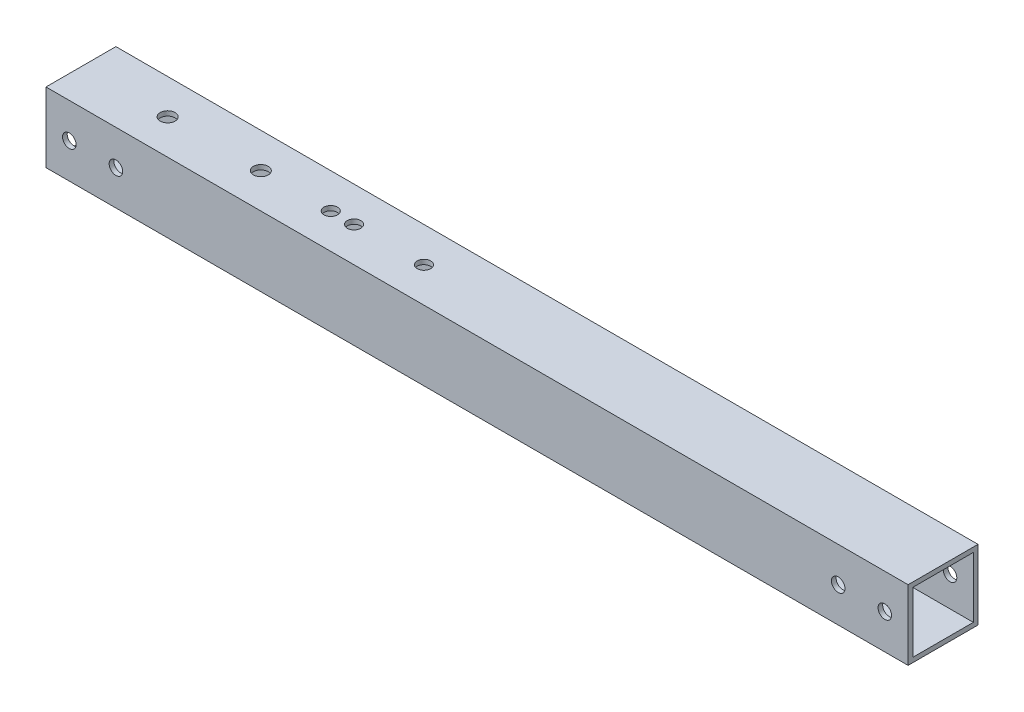
ISO-10303-21;
HEADER;
FILE_DESCRIPTION(('STEP AP214'),'2;1');
FILE_NAME('part.step','',(''),(''),'','','');
FILE_SCHEMA(('AUTOMOTIVE_DESIGN { 1 0 10303 214 1 1 1 1 }'));
ENDSEC;
DATA;
#1=APPLICATION_CONTEXT('core data for automotive mechanical design processes');
#2=APPLICATION_PROTOCOL_DEFINITION('international standard','automotive_design',2000,#1);
#3=PRODUCT_CONTEXT('',#1,'mechanical');
#4=PRODUCT('Part','Part','',(#3));
#5=PRODUCT_RELATED_PRODUCT_CATEGORY('part','',(#4));
#6=PRODUCT_DEFINITION_FORMATION('','',#4);
#7=PRODUCT_DEFINITION_CONTEXT('part definition',#1,'design');
#8=PRODUCT_DEFINITION('design','',#6,#7);
#9=PRODUCT_DEFINITION_SHAPE('','',#8);
#10=(LENGTH_UNIT() NAMED_UNIT(*) SI_UNIT(.MILLI.,.METRE.));
#11=(NAMED_UNIT(*) PLANE_ANGLE_UNIT() SI_UNIT($,.RADIAN.));
#12=(NAMED_UNIT(*) SI_UNIT($,.STERADIAN.) SOLID_ANGLE_UNIT());
#13=UNCERTAINTY_MEASURE_WITH_UNIT(LENGTH_MEASURE(1.E-05),#10,'distance_accuracy_value','');
#14=(GEOMETRIC_REPRESENTATION_CONTEXT(3) GLOBAL_UNCERTAINTY_ASSIGNED_CONTEXT((#13)) GLOBAL_UNIT_ASSIGNED_CONTEXT((#10,
#11,#12)) REPRESENTATION_CONTEXT('',''));
#15=CARTESIAN_POINT('',(0.,0.,0.));
#16=DIRECTION('',(0.,0.,1.));
#17=DIRECTION('',(1.,0.,0.));
#18=AXIS2_PLACEMENT_3D('',#15,#16,#17);
#19=CARTESIAN_POINT('',(185.,0.,0.));
#20=DIRECTION('',(-1.,0.,0.));
#21=DIRECTION('',(0.,0.,1.));
#22=AXIS2_PLACEMENT_3D('',#19,#20,#21);
#23=PLANE('',#22);
#24=DIRECTION('',(0.,1.,0.));
#25=VECTOR('',#24,1.);
#26=CARTESIAN_POINT('',(185.,-7.5,-7.5));
#27=LINE('',#26,#25);
#28=CARTESIAN_POINT('',(185.,-7.5,-7.5));
#29=VERTEX_POINT('',#28);
#30=CARTESIAN_POINT('',(185.,7.5,-7.5));
#31=VERTEX_POINT('',#30);
#32=EDGE_CURVE('E146',#29,#31,#27,.T.);
#33=ORIENTED_EDGE('',*,*,#32,.T.);
#34=DIRECTION('',(0.,0.,1.));
#35=VECTOR('',#34,1.);
#36=CARTESIAN_POINT('',(185.,7.5,7.5));
#37=LINE('',#36,#35);
#38=CARTESIAN_POINT('',(185.,7.5,7.5));
#39=VERTEX_POINT('',#38);
#40=EDGE_CURVE('E149',#31,#39,#37,.T.);
#41=ORIENTED_EDGE('',*,*,#40,.T.);
#42=DIRECTION('',(0.,-1.,0.));
#43=VECTOR('',#42,1.);
#44=CARTESIAN_POINT('',(185.,-7.5,7.5));
#45=LINE('',#44,#43);
#46=CARTESIAN_POINT('',(185.,-7.5,7.5));
#47=VERTEX_POINT('',#46);
#48=EDGE_CURVE('E152',#39,#47,#45,.T.);
#49=ORIENTED_EDGE('',*,*,#48,.T.);
#50=DIRECTION('',(0.,0.,-1.));
#51=VECTOR('',#50,1.);
#52=CARTESIAN_POINT('',(185.,-7.5,7.5));
#53=LINE('',#52,#51);
#54=EDGE_CURVE('E154',#47,#29,#53,.T.);
#55=ORIENTED_EDGE('',*,*,#54,.T.);
#56=EDGE_LOOP('',(#33,#41,#49,#55));
#57=FACE_BOUND('',#56,.T.);
#58=DIRECTION('',(0.,0.,-1.));
#59=VECTOR('',#58,1.);
#60=CARTESIAN_POINT('',(185.,-6.5,6.5));
#61=LINE('',#60,#59);
#62=CARTESIAN_POINT('',(185.,-6.5,6.5));
#63=VERTEX_POINT('',#62);
#64=CARTESIAN_POINT('',(185.,-6.5,-6.5));
#65=VERTEX_POINT('',#64);
#66=EDGE_CURVE('E108',#63,#65,#61,.T.);
#67=ORIENTED_EDGE('',*,*,#66,.F.);
#68=DIRECTION('',(0.,-1.,0.));
#69=VECTOR('',#68,1.);
#70=CARTESIAN_POINT('',(185.,-6.5,6.5));
#71=LINE('',#70,#69);
#72=CARTESIAN_POINT('',(185.,6.5,6.5));
#73=VERTEX_POINT('',#72);
#74=EDGE_CURVE('E130',#73,#63,#71,.T.);
#75=ORIENTED_EDGE('',*,*,#74,.F.);
#76=DIRECTION('',(0.,0.,1.));
#77=VECTOR('',#76,1.);
#78=CARTESIAN_POINT('',(185.,6.5,6.5));
#79=LINE('',#78,#77);
#80=CARTESIAN_POINT('',(185.,6.5,-6.5));
#81=VERTEX_POINT('',#80);
#82=EDGE_CURVE('E128',#81,#73,#79,.T.);
#83=ORIENTED_EDGE('',*,*,#82,.F.);
#84=DIRECTION('',(0.,1.,0.));
#85=VECTOR('',#84,1.);
#86=CARTESIAN_POINT('',(185.,-6.5,-6.5));
#87=LINE('',#86,#85);
#88=EDGE_CURVE('E116',#65,#81,#87,.T.);
#89=ORIENTED_EDGE('',*,*,#88,.F.);
#90=EDGE_LOOP('',(#67,#75,#83,#89));
#91=FACE_BOUND('',#90,.T.);
#92=ADVANCED_FACE('F41',(#57,#91),#23,.F.);
#93=CARTESIAN_POINT('',(0.,0.,0.));
#94=DIRECTION('',(-1.,0.,0.));
#95=DIRECTION('',(0.,0.,1.));
#96=AXIS2_PLACEMENT_3D('',#93,#94,#95);
#97=PLANE('',#96);
#98=DIRECTION('',(0.,1.,0.));
#99=VECTOR('',#98,1.);
#100=CARTESIAN_POINT('',(0.,-7.5,-7.5));
#101=LINE('',#100,#99);
#102=CARTESIAN_POINT('',(0.,-7.5,-7.5));
#103=VERTEX_POINT('',#102);
#104=CARTESIAN_POINT('',(0.,7.5,-7.5));
#105=VERTEX_POINT('',#104);
#106=EDGE_CURVE('E124',#103,#105,#101,.T.);
#107=ORIENTED_EDGE('',*,*,#106,.F.);
#108=DIRECTION('',(0.,0.,-1.));
#109=VECTOR('',#108,1.);
#110=CARTESIAN_POINT('',(0.,-7.5,7.5));
#111=LINE('',#110,#109);
#112=CARTESIAN_POINT('',(0.,-7.5,7.5));
#113=VERTEX_POINT('',#112);
#114=EDGE_CURVE('E150',#113,#103,#111,.T.);
#115=ORIENTED_EDGE('',*,*,#114,.F.);
#116=DIRECTION('',(0.,-1.,0.));
#117=VECTOR('',#116,1.);
#118=CARTESIAN_POINT('',(0.,-7.5,7.5));
#119=LINE('',#118,#117);
#120=CARTESIAN_POINT('',(0.,7.5,7.5));
#121=VERTEX_POINT('',#120);
#122=EDGE_CURVE('E161',#121,#113,#119,.T.);
#123=ORIENTED_EDGE('',*,*,#122,.F.);
#124=DIRECTION('',(0.,0.,1.));
#125=VECTOR('',#124,1.);
#126=CARTESIAN_POINT('',(0.,7.5,7.5));
#127=LINE('',#126,#125);
#128=EDGE_CURVE('E159',#105,#121,#127,.T.);
#129=ORIENTED_EDGE('',*,*,#128,.F.);
#130=EDGE_LOOP('',(#107,#115,#123,#129));
#131=FACE_BOUND('',#130,.T.);
#132=DIRECTION('',(0.,-1.,0.));
#133=VECTOR('',#132,1.);
#134=CARTESIAN_POINT('',(0.,-6.5,6.5));
#135=LINE('',#134,#133);
#136=CARTESIAN_POINT('',(0.,6.5,6.5));
#137=VERTEX_POINT('',#136);
#138=CARTESIAN_POINT('',(0.,-6.5,6.5));
#139=VERTEX_POINT('',#138);
#140=EDGE_CURVE('E117',#137,#139,#135,.T.);
#141=ORIENTED_EDGE('',*,*,#140,.T.);
#142=DIRECTION('',(0.,0.,-1.));
#143=VECTOR('',#142,1.);
#144=CARTESIAN_POINT('',(0.,-6.5,6.5));
#145=LINE('',#144,#143);
#146=CARTESIAN_POINT('',(0.,-6.5,-6.5));
#147=VERTEX_POINT('',#146);
#148=EDGE_CURVE('E66',#139,#147,#145,.T.);
#149=ORIENTED_EDGE('',*,*,#148,.T.);
#150=DIRECTION('',(0.,1.,0.));
#151=VECTOR('',#150,1.);
#152=CARTESIAN_POINT('',(0.,-6.5,-6.5));
#153=LINE('',#152,#151);
#154=CARTESIAN_POINT('',(0.,6.5,-6.5));
#155=VERTEX_POINT('',#154);
#156=EDGE_CURVE('E123',#147,#155,#153,.T.);
#157=ORIENTED_EDGE('',*,*,#156,.T.);
#158=DIRECTION('',(0.,0.,1.));
#159=VECTOR('',#158,1.);
#160=CARTESIAN_POINT('',(0.,6.5,6.5));
#161=LINE('',#160,#159);
#162=EDGE_CURVE('E138',#155,#137,#161,.T.);
#163=ORIENTED_EDGE('',*,*,#162,.T.);
#164=EDGE_LOOP('',(#141,#149,#157,#163));
#165=FACE_BOUND('',#164,.T.);
#166=ADVANCED_FACE('F272',(#131,#165),#97,.T.);
#167=CARTESIAN_POINT('',(185.,-7.5,-7.5));
#168=DIRECTION('',(0.,0.,1.));
#169=DIRECTION('',(1.,0.,0.));
#170=AXIS2_PLACEMENT_3D('',#167,#168,#169);
#171=PLANE('',#170);
#172=CARTESIAN_POINT('',(180.,1.15886948736383E-13,-7.5));
#173=DIRECTION('',(0.,0.,1.));
#174=DIRECTION('',(1.,0.,0.));
#175=AXIS2_PLACEMENT_3D('',#172,#173,#174);
#176=CIRCLE('',#175,1.45);
#177=CARTESIAN_POINT('',(181.45,1.15886948736383E-13,-7.5));
#178=VERTEX_POINT('',#177);
#179=EDGE_CURVE('E175',#178,#178,#176,.T.);
#180=ORIENTED_EDGE('',*,*,#179,.T.);
#181=EDGE_LOOP('',(#180));
#182=FACE_BOUND('',#181,.T.);
#183=CARTESIAN_POINT('',(15.,0.,-7.5));
#184=DIRECTION('',(0.,0.,1.));
#185=DIRECTION('',(1.,0.,0.));
#186=AXIS2_PLACEMENT_3D('',#183,#184,#185);
#187=CIRCLE('',#186,1.45);
#188=CARTESIAN_POINT('',(16.45,0.,-7.5));
#189=VERTEX_POINT('',#188);
#190=EDGE_CURVE('E216',#189,#189,#187,.T.);
#191=ORIENTED_EDGE('',*,*,#190,.T.);
#192=EDGE_LOOP('',(#191));
#193=FACE_BOUND('',#192,.T.);
#194=CARTESIAN_POINT('',(5.,0.,-7.5));
#195=DIRECTION('',(0.,0.,1.));
#196=DIRECTION('',(1.,0.,0.));
#197=AXIS2_PLACEMENT_3D('',#194,#195,#196);
#198=CIRCLE('',#197,1.45);
#199=CARTESIAN_POINT('',(6.45,0.,-7.5));
#200=VERTEX_POINT('',#199);
#201=EDGE_CURVE('E226',#200,#200,#198,.T.);
#202=ORIENTED_EDGE('',*,*,#201,.T.);
#203=EDGE_LOOP('',(#202));
#204=FACE_BOUND('',#203,.T.);
#205=CARTESIAN_POINT('',(170.,1.15659670859662E-13,-7.5));
#206=DIRECTION('',(0.,0.,1.));
#207=DIRECTION('',(1.,0.,0.));
#208=AXIS2_PLACEMENT_3D('',#205,#206,#207);
#209=CIRCLE('',#208,1.44999999999997);
#210=CARTESIAN_POINT('',(171.45,1.15659670859662E-13,-7.5));
#211=VERTEX_POINT('',#210);
#212=EDGE_CURVE('E231',#211,#211,#209,.T.);
#213=ORIENTED_EDGE('',*,*,#212,.T.);
#214=EDGE_LOOP('',(#213));
#215=FACE_BOUND('',#214,.T.);
#216=ORIENTED_EDGE('',*,*,#106,.T.);
#217=DIRECTION('',(-1.,0.,0.));
#218=VECTOR('',#217,1.);
#219=CARTESIAN_POINT('',(185.,7.5,-7.5));
#220=LINE('',#219,#218);
#221=EDGE_CURVE('E11',#31,#105,#220,.T.);
#222=ORIENTED_EDGE('',*,*,#221,.F.);
#223=ORIENTED_EDGE('',*,*,#32,.F.);
#224=DIRECTION('',(-1.,0.,0.));
#225=VECTOR('',#224,1.);
#226=CARTESIAN_POINT('',(185.,-7.5,-7.5));
#227=LINE('',#226,#225);
#228=EDGE_CURVE('E156',#29,#103,#227,.T.);
#229=ORIENTED_EDGE('',*,*,#228,.T.);
#230=EDGE_LOOP('',(#216,#222,#223,#229));
#231=FACE_BOUND('',#230,.T.);
#232=ADVANCED_FACE('F43',(#182,#193,#204,#215,#231),#171,.F.);
#233=CARTESIAN_POINT('',(185.,7.5,7.5));
#234=DIRECTION('',(0.,-1.,0.));
#235=DIRECTION('',(0.,0.,-1.));
#236=AXIS2_PLACEMENT_3D('',#233,#234,#235);
#237=PLANE('',#236);
#238=CARTESIAN_POINT('',(73.6,7.5,0.));
#239=DIRECTION('',(0.,1.,0.));
#240=DIRECTION('',(0.,0.,1.));
#241=AXIS2_PLACEMENT_3D('',#238,#239,#240);
#242=CIRCLE('',#241,1.45);
#243=CARTESIAN_POINT('',(73.6,7.5,1.45));
#244=VERTEX_POINT('',#243);
#245=EDGE_CURVE('E393',#244,#244,#242,.T.);
#246=ORIENTED_EDGE('',*,*,#245,.F.);
#247=EDGE_LOOP('',(#246));
#248=FACE_BOUND('',#247,.T.);
#249=CARTESIAN_POINT('',(58.6,7.5,0.));
#250=DIRECTION('',(0.,1.,0.));
#251=DIRECTION('',(0.,0.,1.));
#252=AXIS2_PLACEMENT_3D('',#249,#250,#251);
#253=CIRCLE('',#252,1.45);
#254=CARTESIAN_POINT('',(58.6,7.5,1.45));
#255=VERTEX_POINT('',#254);
#256=EDGE_CURVE('E387',#255,#255,#253,.T.);
#257=ORIENTED_EDGE('',*,*,#256,.F.);
#258=EDGE_LOOP('',(#257));
#259=FACE_BOUND('',#258,.T.);
#260=CARTESIAN_POINT('',(53.6,7.5,0.));
#261=DIRECTION('',(0.,1.,0.));
#262=DIRECTION('',(0.,0.,1.));
#263=AXIS2_PLACEMENT_3D('',#260,#261,#262);
#264=CIRCLE('',#263,1.45);
#265=CARTESIAN_POINT('',(53.6,7.5,1.45));
#266=VERTEX_POINT('',#265);
#267=EDGE_CURVE('E376',#266,#266,#264,.T.);
#268=ORIENTED_EDGE('',*,*,#267,.F.);
#269=EDGE_LOOP('',(#268));
#270=FACE_BOUND('',#269,.T.);
#271=CARTESIAN_POINT('',(18.6,7.5,0.));
#272=DIRECTION('',(0.,1.,0.));
#273=DIRECTION('',(0.,0.,1.));
#274=AXIS2_PLACEMENT_3D('',#271,#272,#273);
#275=CIRCLE('',#274,1.6);
#276=CARTESIAN_POINT('',(18.6,7.5,1.60000000000001));
#277=VERTEX_POINT('',#276);
#278=EDGE_CURVE('E375',#277,#277,#275,.T.);
#279=ORIENTED_EDGE('',*,*,#278,.F.);
#280=EDGE_LOOP('',(#279));
#281=FACE_BOUND('',#280,.T.);
#282=CARTESIAN_POINT('',(38.6,7.5,0.));
#283=DIRECTION('',(0.,1.,0.));
#284=DIRECTION('',(0.,0.,1.));
#285=AXIS2_PLACEMENT_3D('',#282,#283,#284);
#286=CIRCLE('',#285,1.60000000000001);
#287=CARTESIAN_POINT('',(38.6,7.5,1.60000000000001));
#288=VERTEX_POINT('',#287);
#289=EDGE_CURVE('E379',#288,#288,#286,.T.);
#290=ORIENTED_EDGE('',*,*,#289,.F.);
#291=EDGE_LOOP('',(#290));
#292=FACE_BOUND('',#291,.T.);
#293=ORIENTED_EDGE('',*,*,#128,.T.);
#294=DIRECTION('',(-1.,0.,0.));
#295=VECTOR('',#294,1.);
#296=CARTESIAN_POINT('',(185.,7.5,7.5));
#297=LINE('',#296,#295);
#298=EDGE_CURVE('E50',#39,#121,#297,.T.);
#299=ORIENTED_EDGE('',*,*,#298,.F.);
#300=ORIENTED_EDGE('',*,*,#40,.F.);
#301=ORIENTED_EDGE('',*,*,#221,.T.);
#302=EDGE_LOOP('',(#293,#299,#300,#301));
#303=FACE_BOUND('',#302,.T.);
#304=ADVANCED_FACE('F271',(#248,#259,#270,#281,#292,#303),#237,.F.);
#305=CARTESIAN_POINT('',(185.,-7.5,7.5));
#306=DIRECTION('',(0.,0.,-1.));
#307=DIRECTION('',(-1.,0.,0.));
#308=AXIS2_PLACEMENT_3D('',#305,#306,#307);
#309=PLANE('',#308);
#310=CARTESIAN_POINT('',(180.,1.15886948736383E-13,7.5));
#311=DIRECTION('',(0.,0.,1.));
#312=DIRECTION('',(1.,0.,0.));
#313=AXIS2_PLACEMENT_3D('',#310,#311,#312);
#314=CIRCLE('',#313,1.45);
#315=CARTESIAN_POINT('',(181.45,1.15886948736383E-13,7.5));
#316=VERTEX_POINT('',#315);
#317=EDGE_CURVE('E219',#316,#316,#314,.T.);
#318=ORIENTED_EDGE('',*,*,#317,.F.);
#319=EDGE_LOOP('',(#318));
#320=FACE_BOUND('',#319,.T.);
#321=CARTESIAN_POINT('',(15.,0.,7.5));
#322=DIRECTION('',(0.,0.,1.));
#323=DIRECTION('',(1.,0.,0.));
#324=AXIS2_PLACEMENT_3D('',#321,#322,#323);
#325=CIRCLE('',#324,1.45);
#326=CARTESIAN_POINT('',(16.45,0.,7.5));
#327=VERTEX_POINT('',#326);
#328=EDGE_CURVE('E223',#327,#327,#325,.T.);
#329=ORIENTED_EDGE('',*,*,#328,.F.);
#330=EDGE_LOOP('',(#329));
#331=FACE_BOUND('',#330,.T.);
#332=CARTESIAN_POINT('',(5.,0.,7.5));
#333=DIRECTION('',(0.,0.,1.));
#334=DIRECTION('',(1.,0.,0.));
#335=AXIS2_PLACEMENT_3D('',#332,#333,#334);
#336=CIRCLE('',#335,1.45);
#337=CARTESIAN_POINT('',(6.45,0.,7.5));
#338=VERTEX_POINT('',#337);
#339=EDGE_CURVE('E234',#338,#338,#336,.T.);
#340=ORIENTED_EDGE('',*,*,#339,.F.);
#341=EDGE_LOOP('',(#340));
#342=FACE_BOUND('',#341,.T.);
#343=CARTESIAN_POINT('',(170.,1.15659670859662E-13,7.5));
#344=DIRECTION('',(0.,0.,1.));
#345=DIRECTION('',(1.,0.,0.));
#346=AXIS2_PLACEMENT_3D('',#343,#344,#345);
#347=CIRCLE('',#346,1.44999999999997);
#348=CARTESIAN_POINT('',(171.45,1.15659670859662E-13,7.5));
#349=VERTEX_POINT('',#348);
#350=EDGE_CURVE('E222',#349,#349,#347,.T.);
#351=ORIENTED_EDGE('',*,*,#350,.F.);
#352=EDGE_LOOP('',(#351));
#353=FACE_BOUND('',#352,.T.);
#354=ORIENTED_EDGE('',*,*,#122,.T.);
#355=DIRECTION('',(-1.,0.,0.));
#356=VECTOR('',#355,1.);
#357=CARTESIAN_POINT('',(185.,-7.5,7.5));
#358=LINE('',#357,#356);
#359=EDGE_CURVE('E166',#47,#113,#358,.T.);
#360=ORIENTED_EDGE('',*,*,#359,.F.);
#361=ORIENTED_EDGE('',*,*,#48,.F.);
#362=ORIENTED_EDGE('',*,*,#298,.T.);
#363=EDGE_LOOP('',(#354,#360,#361,#362));
#364=FACE_BOUND('',#363,.T.);
#365=ADVANCED_FACE('F291',(#320,#331,#342,#353,#364),#309,.F.);
#366=CARTESIAN_POINT('',(185.,-7.5,7.5));
#367=DIRECTION('',(0.,1.,0.));
#368=DIRECTION('',(0.,0.,1.));
#369=AXIS2_PLACEMENT_3D('',#366,#367,#368);
#370=PLANE('',#369);
#371=CARTESIAN_POINT('',(73.6,-7.5,0.));
#372=DIRECTION('',(0.,1.,0.));
#373=DIRECTION('',(0.,0.,1.));
#374=AXIS2_PLACEMENT_3D('',#371,#372,#373);
#375=CIRCLE('',#374,1.45);
#376=CARTESIAN_POINT('',(73.6,-7.5,1.45));
#377=VERTEX_POINT('',#376);
#378=EDGE_CURVE('E396',#377,#377,#375,.T.);
#379=ORIENTED_EDGE('',*,*,#378,.T.);
#380=EDGE_LOOP('',(#379));
#381=FACE_BOUND('',#380,.T.);
#382=CARTESIAN_POINT('',(58.6,-7.5,0.));
#383=DIRECTION('',(0.,1.,0.));
#384=DIRECTION('',(0.,0.,1.));
#385=AXIS2_PLACEMENT_3D('',#382,#383,#384);
#386=CIRCLE('',#385,1.45);
#387=CARTESIAN_POINT('',(58.6,-7.5,1.45));
#388=VERTEX_POINT('',#387);
#389=EDGE_CURVE('E390',#388,#388,#386,.T.);
#390=ORIENTED_EDGE('',*,*,#389,.T.);
#391=EDGE_LOOP('',(#390));
#392=FACE_BOUND('',#391,.T.);
#393=CARTESIAN_POINT('',(53.6,-7.5,0.));
#394=DIRECTION('',(0.,1.,0.));
#395=DIRECTION('',(0.,0.,1.));
#396=AXIS2_PLACEMENT_3D('',#393,#394,#395);
#397=CIRCLE('',#396,1.45);
#398=CARTESIAN_POINT('',(53.6,-7.5,1.45));
#399=VERTEX_POINT('',#398);
#400=EDGE_CURVE('E382',#399,#399,#397,.T.);
#401=ORIENTED_EDGE('',*,*,#400,.T.);
#402=EDGE_LOOP('',(#401));
#403=FACE_BOUND('',#402,.T.);
#404=CARTESIAN_POINT('',(18.6,-7.5,0.));
#405=DIRECTION('',(0.,1.,0.));
#406=DIRECTION('',(0.,0.,1.));
#407=AXIS2_PLACEMENT_3D('',#404,#405,#406);
#408=CIRCLE('',#407,1.6);
#409=CARTESIAN_POINT('',(18.6,-7.5,1.60000000000001));
#410=VERTEX_POINT('',#409);
#411=EDGE_CURVE('E373',#410,#410,#408,.T.);
#412=ORIENTED_EDGE('',*,*,#411,.T.);
#413=EDGE_LOOP('',(#412));
#414=FACE_BOUND('',#413,.T.);
#415=CARTESIAN_POINT('',(38.6,-7.5,0.));
#416=DIRECTION('',(0.,1.,0.));
#417=DIRECTION('',(0.,0.,1.));
#418=AXIS2_PLACEMENT_3D('',#415,#416,#417);
#419=CIRCLE('',#418,1.60000000000001);
#420=CARTESIAN_POINT('',(38.6,-7.5,1.60000000000001));
#421=VERTEX_POINT('',#420);
#422=EDGE_CURVE('E191',#421,#421,#419,.T.);
#423=ORIENTED_EDGE('',*,*,#422,.T.);
#424=EDGE_LOOP('',(#423));
#425=FACE_BOUND('',#424,.T.);
#426=ORIENTED_EDGE('',*,*,#114,.T.);
#427=ORIENTED_EDGE('',*,*,#228,.F.);
#428=ORIENTED_EDGE('',*,*,#54,.F.);
#429=ORIENTED_EDGE('',*,*,#359,.T.);
#430=EDGE_LOOP('',(#426,#427,#428,#429));
#431=FACE_BOUND('',#430,.T.);
#432=ADVANCED_FACE('F289',(#381,#392,#403,#414,#425,#431),#370,.F.);
#433=CARTESIAN_POINT('',(185.,-6.5,6.5));
#434=DIRECTION('',(0.,1.,0.));
#435=DIRECTION('',(0.,0.,1.));
#436=AXIS2_PLACEMENT_3D('',#433,#434,#435);
#437=PLANE('',#436);
#438=CARTESIAN_POINT('',(73.6,-6.5,0.));
#439=DIRECTION('',(0.,1.,0.));
#440=DIRECTION('',(0.,0.,1.));
#441=AXIS2_PLACEMENT_3D('',#438,#439,#440);
#442=CIRCLE('',#441,1.45);
#443=CARTESIAN_POINT('',(73.6,-6.5,1.45));
#444=VERTEX_POINT('',#443);
#445=EDGE_CURVE('E213',#444,#444,#442,.T.);
#446=ORIENTED_EDGE('',*,*,#445,.F.);
#447=EDGE_LOOP('',(#446));
#448=FACE_BOUND('',#447,.T.);
#449=CARTESIAN_POINT('',(58.6,-6.5,0.));
#450=DIRECTION('',(0.,1.,0.));
#451=DIRECTION('',(0.,0.,1.));
#452=AXIS2_PLACEMENT_3D('',#449,#450,#451);
#453=CIRCLE('',#452,1.45);
#454=CARTESIAN_POINT('',(58.6,-6.5,1.45));
#455=VERTEX_POINT('',#454);
#456=EDGE_CURVE('E201',#455,#455,#453,.T.);
#457=ORIENTED_EDGE('',*,*,#456,.F.);
#458=EDGE_LOOP('',(#457));
#459=FACE_BOUND('',#458,.T.);
#460=CARTESIAN_POINT('',(53.6,-6.5,0.));
#461=DIRECTION('',(0.,1.,0.));
#462=DIRECTION('',(0.,0.,1.));
#463=AXIS2_PLACEMENT_3D('',#460,#461,#462);
#464=CIRCLE('',#463,1.45);
#465=CARTESIAN_POINT('',(53.6,-6.5,1.45));
#466=VERTEX_POINT('',#465);
#467=EDGE_CURVE('E198',#466,#466,#464,.T.);
#468=ORIENTED_EDGE('',*,*,#467,.F.);
#469=EDGE_LOOP('',(#468));
#470=FACE_BOUND('',#469,.T.);
#471=CARTESIAN_POINT('',(18.6,-6.5,0.));
#472=DIRECTION('',(0.,1.,0.));
#473=DIRECTION('',(0.,0.,1.));
#474=AXIS2_PLACEMENT_3D('',#471,#472,#473);
#475=CIRCLE('',#474,1.6);
#476=CARTESIAN_POINT('',(18.6,-6.5,1.60000000000001));
#477=VERTEX_POINT('',#476);
#478=EDGE_CURVE('E195',#477,#477,#475,.T.);
#479=ORIENTED_EDGE('',*,*,#478,.F.);
#480=EDGE_LOOP('',(#479));
#481=FACE_BOUND('',#480,.T.);
#482=CARTESIAN_POINT('',(38.6,-6.5,0.));
#483=DIRECTION('',(0.,1.,0.));
#484=DIRECTION('',(0.,0.,1.));
#485=AXIS2_PLACEMENT_3D('',#482,#483,#484);
#486=CIRCLE('',#485,1.60000000000001);
#487=CARTESIAN_POINT('',(38.6,-6.5,1.60000000000001));
#488=VERTEX_POINT('',#487);
#489=EDGE_CURVE('E190',#488,#488,#486,.T.);
#490=ORIENTED_EDGE('',*,*,#489,.F.);
#491=EDGE_LOOP('',(#490));
#492=FACE_BOUND('',#491,.T.);
#493=ORIENTED_EDGE('',*,*,#148,.F.);
#494=DIRECTION('',(-1.,0.,0.));
#495=VECTOR('',#494,1.);
#496=CARTESIAN_POINT('',(185.,-6.5,6.5));
#497=LINE('',#496,#495);
#498=EDGE_CURVE('E112',#63,#139,#497,.T.);
#499=ORIENTED_EDGE('',*,*,#498,.F.);
#500=ORIENTED_EDGE('',*,*,#66,.T.);
#501=DIRECTION('',(-1.,0.,0.));
#502=VECTOR('',#501,1.);
#503=CARTESIAN_POINT('',(185.,-6.5,-6.5));
#504=LINE('',#503,#502);
#505=EDGE_CURVE('E111',#65,#147,#504,.T.);
#506=ORIENTED_EDGE('',*,*,#505,.T.);
#507=EDGE_LOOP('',(#493,#499,#500,#506));
#508=FACE_BOUND('',#507,.T.);
#509=ADVANCED_FACE('F110',(#448,#459,#470,#481,#492,#508),#437,.T.);
#510=CARTESIAN_POINT('',(185.,-6.5,-6.5));
#511=DIRECTION('',(0.,0.,1.));
#512=DIRECTION('',(0.,-1.,0.));
#513=AXIS2_PLACEMENT_3D('',#510,#511,#512);
#514=PLANE('',#513);
#515=CARTESIAN_POINT('',(180.,1.15886948736383E-13,-6.5));
#516=DIRECTION('',(0.,0.,1.));
#517=DIRECTION('',(0.,-1.,0.));
#518=AXIS2_PLACEMENT_3D('',#515,#516,#517);
#519=CIRCLE('',#518,1.45);
#520=CARTESIAN_POINT('',(180.,-1.44999999999988,-6.5));
#521=VERTEX_POINT('',#520);
#522=EDGE_CURVE('E136',#521,#521,#519,.T.);
#523=ORIENTED_EDGE('',*,*,#522,.F.);
#524=EDGE_LOOP('',(#523));
#525=FACE_BOUND('',#524,.T.);
#526=CARTESIAN_POINT('',(15.,0.,-6.5));
#527=DIRECTION('',(0.,0.,1.));
#528=DIRECTION('',(0.,-1.,0.));
#529=AXIS2_PLACEMENT_3D('',#526,#527,#528);
#530=CIRCLE('',#529,1.45);
#531=CARTESIAN_POINT('',(15.,-1.45,-6.5));
#532=VERTEX_POINT('',#531);
#533=EDGE_CURVE('E183',#532,#532,#530,.T.);
#534=ORIENTED_EDGE('',*,*,#533,.F.);
#535=EDGE_LOOP('',(#534));
#536=FACE_BOUND('',#535,.T.);
#537=CARTESIAN_POINT('',(5.,0.,-6.5));
#538=DIRECTION('',(0.,0.,1.));
#539=DIRECTION('',(0.,-1.,0.));
#540=AXIS2_PLACEMENT_3D('',#537,#538,#539);
#541=CIRCLE('',#540,1.45);
#542=CARTESIAN_POINT('',(5.,-1.45,-6.5));
#543=VERTEX_POINT('',#542);
#544=EDGE_CURVE('E179',#543,#543,#541,.T.);
#545=ORIENTED_EDGE('',*,*,#544,.F.);
#546=EDGE_LOOP('',(#545));
#547=FACE_BOUND('',#546,.T.);
#548=CARTESIAN_POINT('',(170.,1.15659670859662E-13,-6.5));
#549=DIRECTION('',(0.,0.,1.));
#550=DIRECTION('',(0.,-1.,0.));
#551=AXIS2_PLACEMENT_3D('',#548,#549,#550);
#552=CIRCLE('',#551,1.44999999999997);
#553=CARTESIAN_POINT('',(170.,-1.44999999999986,-6.5));
#554=VERTEX_POINT('',#553);
#555=EDGE_CURVE('E174',#554,#554,#552,.T.);
#556=ORIENTED_EDGE('',*,*,#555,.F.);
#557=EDGE_LOOP('',(#556));
#558=FACE_BOUND('',#557,.T.);
#559=ORIENTED_EDGE('',*,*,#156,.F.);
#560=ORIENTED_EDGE('',*,*,#505,.F.);
#561=ORIENTED_EDGE('',*,*,#88,.T.);
#562=DIRECTION('',(-1.,0.,0.));
#563=VECTOR('',#562,1.);
#564=CARTESIAN_POINT('',(185.,6.5,-6.5));
#565=LINE('',#564,#563);
#566=EDGE_CURVE('E125',#81,#155,#565,.T.);
#567=ORIENTED_EDGE('',*,*,#566,.T.);
#568=EDGE_LOOP('',(#559,#560,#561,#567));
#569=FACE_BOUND('',#568,.T.);
#570=ADVANCED_FACE('F120',(#525,#536,#547,#558,#569),#514,.T.);
#571=CARTESIAN_POINT('',(185.,6.5,6.5));
#572=DIRECTION('',(0.,-1.,0.));
#573=DIRECTION('',(0.,0.,-1.));
#574=AXIS2_PLACEMENT_3D('',#571,#572,#573);
#575=PLANE('',#574);
#576=CARTESIAN_POINT('',(73.6,6.5,0.));
#577=DIRECTION('',(0.,-1.,0.));
#578=DIRECTION('',(0.,0.,-1.));
#579=AXIS2_PLACEMENT_3D('',#576,#577,#578);
#580=CIRCLE('',#579,1.45);
#581=CARTESIAN_POINT('',(73.6,6.5,-1.45));
#582=VERTEX_POINT('',#581);
#583=EDGE_CURVE('E45',#582,#582,#580,.T.);
#584=ORIENTED_EDGE('',*,*,#583,.F.);
#585=EDGE_LOOP('',(#584));
#586=FACE_BOUND('',#585,.T.);
#587=CARTESIAN_POINT('',(58.6,6.5,0.));
#588=DIRECTION('',(0.,-1.,0.));
#589=DIRECTION('',(0.,0.,-1.));
#590=AXIS2_PLACEMENT_3D('',#587,#588,#589);
#591=CIRCLE('',#590,1.45);
#592=CARTESIAN_POINT('',(58.6,6.5,-1.45));
#593=VERTEX_POINT('',#592);
#594=EDGE_CURVE('E199',#593,#593,#591,.T.);
#595=ORIENTED_EDGE('',*,*,#594,.F.);
#596=EDGE_LOOP('',(#595));
#597=FACE_BOUND('',#596,.T.);
#598=CARTESIAN_POINT('',(53.6,6.5,0.));
#599=DIRECTION('',(0.,-1.,0.));
#600=DIRECTION('',(0.,0.,-1.));
#601=AXIS2_PLACEMENT_3D('',#598,#599,#600);
#602=CIRCLE('',#601,1.45);
#603=CARTESIAN_POINT('',(53.6,6.5,-1.45));
#604=VERTEX_POINT('',#603);
#605=EDGE_CURVE('E196',#604,#604,#602,.T.);
#606=ORIENTED_EDGE('',*,*,#605,.F.);
#607=EDGE_LOOP('',(#606));
#608=FACE_BOUND('',#607,.T.);
#609=CARTESIAN_POINT('',(18.6,6.5,0.));
#610=DIRECTION('',(0.,-1.,0.));
#611=DIRECTION('',(0.,0.,-1.));
#612=AXIS2_PLACEMENT_3D('',#609,#610,#611);
#613=CIRCLE('',#612,1.6);
#614=CARTESIAN_POINT('',(18.6,6.5,-1.59999999999999));
#615=VERTEX_POINT('',#614);
#616=EDGE_CURVE('E192',#615,#615,#613,.T.);
#617=ORIENTED_EDGE('',*,*,#616,.F.);
#618=EDGE_LOOP('',(#617));
#619=FACE_BOUND('',#618,.T.);
#620=CARTESIAN_POINT('',(38.6,6.5,0.));
#621=DIRECTION('',(0.,-1.,0.));
#622=DIRECTION('',(0.,0.,-1.));
#623=AXIS2_PLACEMENT_3D('',#620,#621,#622);
#624=CIRCLE('',#623,1.60000000000001);
#625=CARTESIAN_POINT('',(38.6,6.5,-1.6));
#626=VERTEX_POINT('',#625);
#627=EDGE_CURVE('E187',#626,#626,#624,.T.);
#628=ORIENTED_EDGE('',*,*,#627,.F.);
#629=EDGE_LOOP('',(#628));
#630=FACE_BOUND('',#629,.T.);
#631=ORIENTED_EDGE('',*,*,#162,.F.);
#632=ORIENTED_EDGE('',*,*,#566,.F.);
#633=ORIENTED_EDGE('',*,*,#82,.T.);
#634=DIRECTION('',(-1.,0.,0.));
#635=VECTOR('',#634,1.);
#636=CARTESIAN_POINT('',(185.,6.5,6.5));
#637=LINE('',#636,#635);
#638=EDGE_CURVE('E58',#73,#137,#637,.T.);
#639=ORIENTED_EDGE('',*,*,#638,.T.);
#640=EDGE_LOOP('',(#631,#632,#633,#639));
#641=FACE_BOUND('',#640,.T.);
#642=ADVANCED_FACE('F252',(#586,#597,#608,#619,#630,#641),#575,.T.);
#643=CARTESIAN_POINT('',(185.,-6.5,6.5));
#644=DIRECTION('',(0.,0.,-1.));
#645=DIRECTION('',(-1.,0.,0.));
#646=AXIS2_PLACEMENT_3D('',#643,#644,#645);
#647=PLANE('',#646);
#648=CARTESIAN_POINT('',(180.,1.15886948736383E-13,6.5));
#649=DIRECTION('',(0.,0.,-1.));
#650=DIRECTION('',(-1.,0.,0.));
#651=AXIS2_PLACEMENT_3D('',#648,#649,#650);
#652=CIRCLE('',#651,1.45);
#653=CARTESIAN_POINT('',(178.55,1.15886948736383E-13,6.5));
#654=VERTEX_POINT('',#653);
#655=EDGE_CURVE('E184',#654,#654,#652,.T.);
#656=ORIENTED_EDGE('',*,*,#655,.F.);
#657=EDGE_LOOP('',(#656));
#658=FACE_BOUND('',#657,.T.);
#659=CARTESIAN_POINT('',(15.,0.,6.5));
#660=DIRECTION('',(0.,0.,-1.));
#661=DIRECTION('',(-1.,0.,0.));
#662=AXIS2_PLACEMENT_3D('',#659,#660,#661);
#663=CIRCLE('',#662,1.45);
#664=CARTESIAN_POINT('',(13.55,0.,6.5));
#665=VERTEX_POINT('',#664);
#666=EDGE_CURVE('E180',#665,#665,#663,.T.);
#667=ORIENTED_EDGE('',*,*,#666,.F.);
#668=EDGE_LOOP('',(#667));
#669=FACE_BOUND('',#668,.T.);
#670=CARTESIAN_POINT('',(5.,0.,6.5));
#671=DIRECTION('',(0.,0.,-1.));
#672=DIRECTION('',(-1.,0.,0.));
#673=AXIS2_PLACEMENT_3D('',#670,#671,#672);
#674=CIRCLE('',#673,1.45);
#675=CARTESIAN_POINT('',(3.55,0.,6.5));
#676=VERTEX_POINT('',#675);
#677=EDGE_CURVE('E176',#676,#676,#674,.T.);
#678=ORIENTED_EDGE('',*,*,#677,.F.);
#679=EDGE_LOOP('',(#678));
#680=FACE_BOUND('',#679,.T.);
#681=CARTESIAN_POINT('',(170.,1.15659670859662E-13,6.5));
#682=DIRECTION('',(0.,0.,-1.));
#683=DIRECTION('',(-1.,0.,0.));
#684=AXIS2_PLACEMENT_3D('',#681,#682,#683);
#685=CIRCLE('',#684,1.44999999999997);
#686=CARTESIAN_POINT('',(168.55,1.15659670859662E-13,6.5));
#687=VERTEX_POINT('',#686);
#688=EDGE_CURVE('E171',#687,#687,#685,.T.);
#689=ORIENTED_EDGE('',*,*,#688,.F.);
#690=EDGE_LOOP('',(#689));
#691=FACE_BOUND('',#690,.T.);
#692=ORIENTED_EDGE('',*,*,#140,.F.);
#693=ORIENTED_EDGE('',*,*,#638,.F.);
#694=ORIENTED_EDGE('',*,*,#74,.T.);
#695=ORIENTED_EDGE('',*,*,#498,.T.);
#696=EDGE_LOOP('',(#692,#693,#694,#695));
#697=FACE_BOUND('',#696,.T.);
#698=ADVANCED_FACE('F316',(#658,#669,#680,#691,#697),#647,.T.);
#699=CARTESIAN_POINT('',(170.,1.15659670859662E-13,-7.5));
#700=DIRECTION('',(0.,0.,1.));
#701=DIRECTION('',(1.,0.,0.));
#702=AXIS2_PLACEMENT_3D('',#699,#700,#701);
#703=CYLINDRICAL_SURFACE('',#702,1.44999999999997);
#704=ORIENTED_EDGE('',*,*,#688,.T.);
#705=EDGE_LOOP('',(#704));
#706=FACE_BOUND('',#705,.T.);
#707=ORIENTED_EDGE('',*,*,#350,.T.);
#708=EDGE_LOOP('',(#707));
#709=FACE_BOUND('',#708,.T.);
#710=ADVANCED_FACE('F266',(#706,#709),#703,.F.);
#711=CARTESIAN_POINT('',(5.,0.,-7.5));
#712=DIRECTION('',(0.,0.,1.));
#713=DIRECTION('',(1.,0.,0.));
#714=AXIS2_PLACEMENT_3D('',#711,#712,#713);
#715=CYLINDRICAL_SURFACE('',#714,1.45);
#716=ORIENTED_EDGE('',*,*,#677,.T.);
#717=EDGE_LOOP('',(#716));
#718=FACE_BOUND('',#717,.T.);
#719=ORIENTED_EDGE('',*,*,#339,.T.);
#720=EDGE_LOOP('',(#719));
#721=FACE_BOUND('',#720,.T.);
#722=ADVANCED_FACE('F321',(#718,#721),#715,.F.);
#723=CARTESIAN_POINT('',(15.,0.,-7.5));
#724=DIRECTION('',(0.,0.,1.));
#725=DIRECTION('',(1.,0.,0.));
#726=AXIS2_PLACEMENT_3D('',#723,#724,#725);
#727=CYLINDRICAL_SURFACE('',#726,1.45);
#728=ORIENTED_EDGE('',*,*,#666,.T.);
#729=EDGE_LOOP('',(#728));
#730=FACE_BOUND('',#729,.T.);
#731=ORIENTED_EDGE('',*,*,#328,.T.);
#732=EDGE_LOOP('',(#731));
#733=FACE_BOUND('',#732,.T.);
#734=ADVANCED_FACE('F323',(#730,#733),#727,.F.);
#735=CARTESIAN_POINT('',(180.,1.15886948736383E-13,-7.5));
#736=DIRECTION('',(0.,0.,1.));
#737=DIRECTION('',(1.,0.,0.));
#738=AXIS2_PLACEMENT_3D('',#735,#736,#737);
#739=CYLINDRICAL_SURFACE('',#738,1.45);
#740=ORIENTED_EDGE('',*,*,#655,.T.);
#741=EDGE_LOOP('',(#740));
#742=FACE_BOUND('',#741,.T.);
#743=ORIENTED_EDGE('',*,*,#317,.T.);
#744=EDGE_LOOP('',(#743));
#745=FACE_BOUND('',#744,.T.);
#746=ADVANCED_FACE('F264',(#742,#745),#739,.F.);
#747=ORIENTED_EDGE('',*,*,#555,.T.);
#748=EDGE_LOOP('',(#747));
#749=FACE_BOUND('',#748,.T.);
#750=ORIENTED_EDGE('',*,*,#212,.F.);
#751=EDGE_LOOP('',(#750));
#752=FACE_BOUND('',#751,.T.);
#753=ADVANCED_FACE('F260',(#749,#752),#703,.F.);
#754=ORIENTED_EDGE('',*,*,#544,.T.);
#755=EDGE_LOOP('',(#754));
#756=FACE_BOUND('',#755,.T.);
#757=ORIENTED_EDGE('',*,*,#201,.F.);
#758=EDGE_LOOP('',(#757));
#759=FACE_BOUND('',#758,.T.);
#760=ADVANCED_FACE('F263',(#756,#759),#715,.F.);
#761=ORIENTED_EDGE('',*,*,#533,.T.);
#762=EDGE_LOOP('',(#761));
#763=FACE_BOUND('',#762,.T.);
#764=ORIENTED_EDGE('',*,*,#190,.F.);
#765=EDGE_LOOP('',(#764));
#766=FACE_BOUND('',#765,.T.);
#767=ADVANCED_FACE('F331',(#763,#766),#727,.F.);
#768=ORIENTED_EDGE('',*,*,#522,.T.);
#769=EDGE_LOOP('',(#768));
#770=FACE_BOUND('',#769,.T.);
#771=ORIENTED_EDGE('',*,*,#179,.F.);
#772=EDGE_LOOP('',(#771));
#773=FACE_BOUND('',#772,.T.);
#774=ADVANCED_FACE('F247',(#770,#773),#739,.F.);
#775=CARTESIAN_POINT('',(38.6,-7.5,0.));
#776=DIRECTION('',(0.,1.,0.));
#777=DIRECTION('',(0.,0.,1.));
#778=AXIS2_PLACEMENT_3D('',#775,#776,#777);
#779=CYLINDRICAL_SURFACE('',#778,1.60000000000001);
#780=ORIENTED_EDGE('',*,*,#627,.T.);
#781=EDGE_LOOP('',(#780));
#782=FACE_BOUND('',#781,.T.);
#783=ORIENTED_EDGE('',*,*,#289,.T.);
#784=EDGE_LOOP('',(#783));
#785=FACE_BOUND('',#784,.T.);
#786=ADVANCED_FACE('F335',(#782,#785),#779,.F.);
#787=CARTESIAN_POINT('',(18.6,-7.5,0.));
#788=DIRECTION('',(0.,1.,0.));
#789=DIRECTION('',(0.,0.,1.));
#790=AXIS2_PLACEMENT_3D('',#787,#788,#789);
#791=CYLINDRICAL_SURFACE('',#790,1.6);
#792=ORIENTED_EDGE('',*,*,#616,.T.);
#793=EDGE_LOOP('',(#792));
#794=FACE_BOUND('',#793,.T.);
#795=ORIENTED_EDGE('',*,*,#278,.T.);
#796=EDGE_LOOP('',(#795));
#797=FACE_BOUND('',#796,.T.);
#798=ADVANCED_FACE('F338',(#794,#797),#791,.F.);
#799=CARTESIAN_POINT('',(53.6,-7.5,0.));
#800=DIRECTION('',(0.,1.,0.));
#801=DIRECTION('',(0.,0.,1.));
#802=AXIS2_PLACEMENT_3D('',#799,#800,#801);
#803=CYLINDRICAL_SURFACE('',#802,1.45);
#804=ORIENTED_EDGE('',*,*,#605,.T.);
#805=EDGE_LOOP('',(#804));
#806=FACE_BOUND('',#805,.T.);
#807=ORIENTED_EDGE('',*,*,#267,.T.);
#808=EDGE_LOOP('',(#807));
#809=FACE_BOUND('',#808,.T.);
#810=ADVANCED_FACE('F349',(#806,#809),#803,.F.);
#811=CARTESIAN_POINT('',(58.6,-7.5,0.));
#812=DIRECTION('',(0.,1.,0.));
#813=DIRECTION('',(0.,0.,1.));
#814=AXIS2_PLACEMENT_3D('',#811,#812,#813);
#815=CYLINDRICAL_SURFACE('',#814,1.45);
#816=ORIENTED_EDGE('',*,*,#594,.T.);
#817=EDGE_LOOP('',(#816));
#818=FACE_BOUND('',#817,.T.);
#819=ORIENTED_EDGE('',*,*,#256,.T.);
#820=EDGE_LOOP('',(#819));
#821=FACE_BOUND('',#820,.T.);
#822=ADVANCED_FACE('F344',(#818,#821),#815,.F.);
#823=CARTESIAN_POINT('',(73.6,-7.5,0.));
#824=DIRECTION('',(0.,1.,0.));
#825=DIRECTION('',(0.,0.,1.));
#826=AXIS2_PLACEMENT_3D('',#823,#824,#825);
#827=CYLINDRICAL_SURFACE('',#826,1.45);
#828=ORIENTED_EDGE('',*,*,#583,.T.);
#829=EDGE_LOOP('',(#828));
#830=FACE_BOUND('',#829,.T.);
#831=ORIENTED_EDGE('',*,*,#245,.T.);
#832=EDGE_LOOP('',(#831));
#833=FACE_BOUND('',#832,.T.);
#834=ADVANCED_FACE('F341',(#830,#833),#827,.F.);
#835=ORIENTED_EDGE('',*,*,#489,.T.);
#836=EDGE_LOOP('',(#835));
#837=FACE_BOUND('',#836,.T.);
#838=ORIENTED_EDGE('',*,*,#422,.F.);
#839=EDGE_LOOP('',(#838));
#840=FACE_BOUND('',#839,.T.);
#841=ADVANCED_FACE('F340',(#837,#840),#779,.F.);
#842=ORIENTED_EDGE('',*,*,#478,.T.);
#843=EDGE_LOOP('',(#842));
#844=FACE_BOUND('',#843,.T.);
#845=ORIENTED_EDGE('',*,*,#411,.F.);
#846=EDGE_LOOP('',(#845));
#847=FACE_BOUND('',#846,.T.);
#848=ADVANCED_FACE('F357',(#844,#847),#791,.F.);
#849=ORIENTED_EDGE('',*,*,#467,.T.);
#850=EDGE_LOOP('',(#849));
#851=FACE_BOUND('',#850,.T.);
#852=ORIENTED_EDGE('',*,*,#400,.F.);
#853=EDGE_LOOP('',(#852));
#854=FACE_BOUND('',#853,.T.);
#855=ADVANCED_FACE('F354',(#851,#854),#803,.F.);
#856=ORIENTED_EDGE('',*,*,#456,.T.);
#857=EDGE_LOOP('',(#856));
#858=FACE_BOUND('',#857,.T.);
#859=ORIENTED_EDGE('',*,*,#389,.F.);
#860=EDGE_LOOP('',(#859));
#861=FACE_BOUND('',#860,.T.);
#862=ADVANCED_FACE('F350',(#858,#861),#815,.F.);
#863=ORIENTED_EDGE('',*,*,#445,.T.);
#864=EDGE_LOOP('',(#863));
#865=FACE_BOUND('',#864,.T.);
#866=ORIENTED_EDGE('',*,*,#378,.F.);
#867=EDGE_LOOP('',(#866));
#868=FACE_BOUND('',#867,.T.);
#869=ADVANCED_FACE('F346',(#865,#868),#827,.F.);
#870=CLOSED_SHELL('',(#92,#166,#232,#304,#365,#432,#509,#570,#642,#698,#710,#722,#734,#746,#753,
#760,#767,#774,#786,#798,#810,#822,#834,#841,#848,#855,#862,#869));
#871=MANIFOLD_SOLID_BREP('B2',#870);
#872=ADVANCED_BREP_SHAPE_REPRESENTATION('',(#18,#871),#14);
#873=SHAPE_DEFINITION_REPRESENTATION(#9,#872);
ENDSEC;
END-ISO-10303-21;
